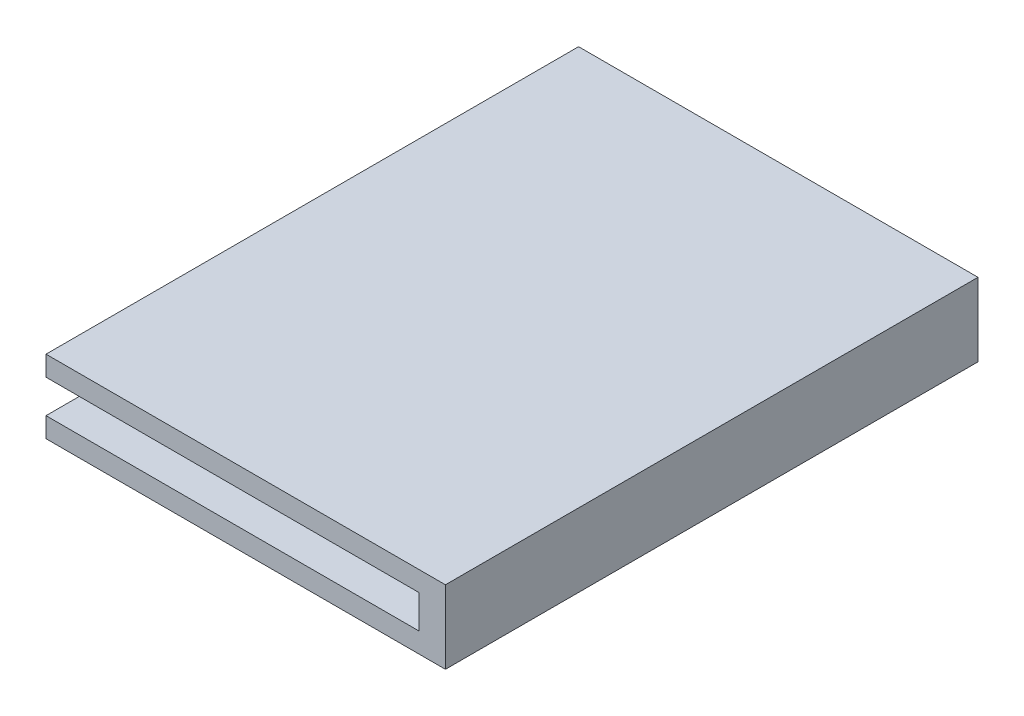
ISO-10303-21;
HEADER;
FILE_DESCRIPTION(('STEP AP214'),'2;1');
FILE_NAME('part.step','',(''),(''),'','','');
FILE_SCHEMA(('AUTOMOTIVE_DESIGN { 1 0 10303 214 1 1 1 1 }'));
ENDSEC;
DATA;
#1=APPLICATION_CONTEXT('core data for automotive mechanical design processes');
#2=APPLICATION_PROTOCOL_DEFINITION('international standard','automotive_design',2000,#1);
#3=PRODUCT_CONTEXT('',#1,'mechanical');
#4=PRODUCT('Part','Part','',(#3));
#5=PRODUCT_RELATED_PRODUCT_CATEGORY('part','',(#4));
#6=PRODUCT_DEFINITION_FORMATION('','',#4);
#7=PRODUCT_DEFINITION_CONTEXT('part definition',#1,'design');
#8=PRODUCT_DEFINITION('design','',#6,#7);
#9=PRODUCT_DEFINITION_SHAPE('','',#8);
#10=(LENGTH_UNIT() NAMED_UNIT(*) SI_UNIT(.MILLI.,.METRE.));
#11=(NAMED_UNIT(*) PLANE_ANGLE_UNIT() SI_UNIT($,.RADIAN.));
#12=(NAMED_UNIT(*) SI_UNIT($,.STERADIAN.) SOLID_ANGLE_UNIT());
#13=UNCERTAINTY_MEASURE_WITH_UNIT(LENGTH_MEASURE(1.E-05),#10,'distance_accuracy_value','');
#14=(GEOMETRIC_REPRESENTATION_CONTEXT(3) GLOBAL_UNCERTAINTY_ASSIGNED_CONTEXT((#13)) GLOBAL_UNIT_ASSIGNED_CONTEXT((#10,
#11,#12)) REPRESENTATION_CONTEXT('',''));
#15=CARTESIAN_POINT('',(0.,0.,0.));
#16=DIRECTION('',(0.,0.,1.));
#17=DIRECTION('',(1.,0.,0.));
#18=AXIS2_PLACEMENT_3D('',#15,#16,#17);
#19=CARTESIAN_POINT('',(-56.,0.,80.));
#20=DIRECTION('',(0.,1.,0.));
#21=DIRECTION('',(0.,0.,1.));
#22=AXIS2_PLACEMENT_3D('',#19,#20,#21);
#23=PLANE('',#22);
#24=DIRECTION('',(1.,0.,0.));
#25=VECTOR('',#24,1.);
#26=CARTESIAN_POINT('',(-56.,0.,0.));
#27=LINE('',#26,#25);
#28=CARTESIAN_POINT('',(-56.,0.,0.));
#29=VERTEX_POINT('',#28);
#30=CARTESIAN_POINT('',(0.,0.,0.));
#31=VERTEX_POINT('',#30);
#32=EDGE_CURVE('E140',#29,#31,#27,.T.);
#33=ORIENTED_EDGE('',*,*,#32,.T.);
#34=DIRECTION('',(0.,0.,-1.));
#35=VECTOR('',#34,1.);
#36=CARTESIAN_POINT('',(0.,0.,80.));
#37=LINE('',#36,#35);
#38=CARTESIAN_POINT('',(0.,0.,80.));
#39=VERTEX_POINT('',#38);
#40=EDGE_CURVE('E11',#39,#31,#37,.T.);
#41=ORIENTED_EDGE('',*,*,#40,.F.);
#42=DIRECTION('',(1.,0.,0.));
#43=VECTOR('',#42,1.);
#44=CARTESIAN_POINT('',(-56.,0.,80.));
#45=LINE('',#44,#43);
#46=CARTESIAN_POINT('',(-56.,0.,80.));
#47=VERTEX_POINT('',#46);
#48=EDGE_CURVE('E162',#47,#39,#45,.T.);
#49=ORIENTED_EDGE('',*,*,#48,.F.);
#50=DIRECTION('',(0.,0.,-1.));
#51=VECTOR('',#50,1.);
#52=CARTESIAN_POINT('',(-56.,0.,80.));
#53=LINE('',#52,#51);
#54=EDGE_CURVE('E136',#47,#29,#53,.T.);
#55=ORIENTED_EDGE('',*,*,#54,.T.);
#56=EDGE_LOOP('',(#33,#41,#49,#55));
#57=FACE_BOUND('',#56,.T.);
#58=ADVANCED_FACE('F39',(#57),#23,.F.);
#59=CARTESIAN_POINT('',(0.,0.,80.));
#60=DIRECTION('',(1.,0.,0.));
#61=DIRECTION('',(0.,0.,-1.));
#62=AXIS2_PLACEMENT_3D('',#59,#60,#61);
#63=PLANE('',#62);
#64=DIRECTION('',(0.,-1.,0.));
#65=VECTOR('',#64,1.);
#66=CARTESIAN_POINT('',(0.,0.,0.));
#67=LINE('',#66,#65);
#68=CARTESIAN_POINT('',(0.,-5.,0.));
#69=VERTEX_POINT('',#68);
#70=EDGE_CURVE('E144',#31,#69,#67,.T.);
#71=ORIENTED_EDGE('',*,*,#70,.T.);
#72=DIRECTION('',(0.,0.,-1.));
#73=VECTOR('',#72,1.);
#74=CARTESIAN_POINT('',(0.,-5.,80.));
#75=LINE('',#74,#73);
#76=CARTESIAN_POINT('',(0.,-5.,80.));
#77=VERTEX_POINT('',#76);
#78=EDGE_CURVE('E48',#77,#69,#75,.T.);
#79=ORIENTED_EDGE('',*,*,#78,.F.);
#80=DIRECTION('',(0.,-1.,0.));
#81=VECTOR('',#80,1.);
#82=CARTESIAN_POINT('',(0.,0.,80.));
#83=LINE('',#82,#81);
#84=EDGE_CURVE('E99',#39,#77,#83,.T.);
#85=ORIENTED_EDGE('',*,*,#84,.F.);
#86=ORIENTED_EDGE('',*,*,#40,.T.);
#87=EDGE_LOOP('',(#71,#79,#85,#86));
#88=FACE_BOUND('',#87,.T.);
#89=ADVANCED_FACE('F208',(#88),#63,.F.);
#90=CARTESIAN_POINT('',(0.,-5.,80.));
#91=DIRECTION('',(0.,-1.,0.));
#92=DIRECTION('',(1.,0.,0.));
#93=AXIS2_PLACEMENT_3D('',#90,#91,#92);
#94=PLANE('',#93);
#95=DIRECTION('',(-1.,0.,0.));
#96=VECTOR('',#95,1.);
#97=CARTESIAN_POINT('',(0.,-5.,0.));
#98=LINE('',#97,#96);
#99=CARTESIAN_POINT('',(-56.,-5.00000000000001,0.));
#100=VERTEX_POINT('',#99);
#101=EDGE_CURVE('E147',#69,#100,#98,.T.);
#102=ORIENTED_EDGE('',*,*,#101,.T.);
#103=DIRECTION('',(0.,0.,-1.));
#104=VECTOR('',#103,1.);
#105=CARTESIAN_POINT('',(-56.,-5.00000000000001,80.));
#106=LINE('',#105,#104);
#107=CARTESIAN_POINT('',(-56.,-5.00000000000001,80.));
#108=VERTEX_POINT('',#107);
#109=EDGE_CURVE('E173',#108,#100,#106,.T.);
#110=ORIENTED_EDGE('',*,*,#109,.F.);
#111=DIRECTION('',(-1.,0.,0.));
#112=VECTOR('',#111,1.);
#113=CARTESIAN_POINT('',(0.,-5.,80.));
#114=LINE('',#113,#112);
#115=EDGE_CURVE('E183',#77,#108,#114,.T.);
#116=ORIENTED_EDGE('',*,*,#115,.F.);
#117=ORIENTED_EDGE('',*,*,#78,.T.);
#118=EDGE_LOOP('',(#102,#110,#116,#117));
#119=FACE_BOUND('',#118,.T.);
#120=ADVANCED_FACE('F181',(#119),#94,.F.);
#121=CARTESIAN_POINT('',(-56.,-5.00000000000001,80.));
#122=DIRECTION('',(1.,0.,0.));
#123=DIRECTION('',(0.,0.,-1.));
#124=AXIS2_PLACEMENT_3D('',#121,#122,#123);
#125=PLANE('',#124);
#126=DIRECTION('',(0.,-1.,0.));
#127=VECTOR('',#126,1.);
#128=CARTESIAN_POINT('',(-56.,-5.00000000000001,0.));
#129=LINE('',#128,#127);
#130=CARTESIAN_POINT('',(-56.,-8.00000000000001,0.));
#131=VERTEX_POINT('',#130);
#132=EDGE_CURVE('E150',#100,#131,#129,.T.);
#133=ORIENTED_EDGE('',*,*,#132,.T.);
#134=DIRECTION('',(0.,0.,-1.));
#135=VECTOR('',#134,1.);
#136=CARTESIAN_POINT('',(-56.,-8.00000000000001,80.));
#137=LINE('',#136,#135);
#138=CARTESIAN_POINT('',(-56.,-8.00000000000001,80.));
#139=VERTEX_POINT('',#138);
#140=EDGE_CURVE('E169',#139,#131,#137,.T.);
#141=ORIENTED_EDGE('',*,*,#140,.F.);
#142=DIRECTION('',(0.,-1.,0.));
#143=VECTOR('',#142,1.);
#144=CARTESIAN_POINT('',(-56.,-5.00000000000001,80.));
#145=LINE('',#144,#143);
#146=EDGE_CURVE('E196',#108,#139,#145,.T.);
#147=ORIENTED_EDGE('',*,*,#146,.F.);
#148=ORIENTED_EDGE('',*,*,#109,.T.);
#149=EDGE_LOOP('',(#133,#141,#147,#148));
#150=FACE_BOUND('',#149,.T.);
#151=ADVANCED_FACE('F191',(#150),#125,.F.);
#152=CARTESIAN_POINT('',(-56.,-8.00000000000001,80.));
#153=DIRECTION('',(0.,1.,0.));
#154=DIRECTION('',(0.,0.,1.));
#155=AXIS2_PLACEMENT_3D('',#152,#153,#154);
#156=PLANE('',#155);
#157=DIRECTION('',(1.,0.,0.));
#158=VECTOR('',#157,1.);
#159=CARTESIAN_POINT('',(-56.,-8.00000000000001,0.));
#160=LINE('',#159,#158);
#161=CARTESIAN_POINT('',(4.,-8.00000000000001,0.));
#162=VERTEX_POINT('',#161);
#163=EDGE_CURVE('E153',#131,#162,#160,.T.);
#164=ORIENTED_EDGE('',*,*,#163,.T.);
#165=DIRECTION('',(0.,0.,-1.));
#166=VECTOR('',#165,1.);
#167=CARTESIAN_POINT('',(4.,-8.00000000000001,80.));
#168=LINE('',#167,#166);
#169=CARTESIAN_POINT('',(4.,-8.00000000000001,80.));
#170=VERTEX_POINT('',#169);
#171=EDGE_CURVE('E129',#170,#162,#168,.T.);
#172=ORIENTED_EDGE('',*,*,#171,.F.);
#173=DIRECTION('',(1.,0.,0.));
#174=VECTOR('',#173,1.);
#175=CARTESIAN_POINT('',(-56.,-8.00000000000001,80.));
#176=LINE('',#175,#174);
#177=EDGE_CURVE('E118',#139,#170,#176,.T.);
#178=ORIENTED_EDGE('',*,*,#177,.F.);
#179=ORIENTED_EDGE('',*,*,#140,.T.);
#180=EDGE_LOOP('',(#164,#172,#178,#179));
#181=FACE_BOUND('',#180,.T.);
#182=ADVANCED_FACE('F194',(#181),#156,.F.);
#183=CARTESIAN_POINT('',(4.,-8.00000000000001,80.));
#184=DIRECTION('',(-1.,0.,0.));
#185=DIRECTION('',(0.,0.,1.));
#186=AXIS2_PLACEMENT_3D('',#183,#184,#185);
#187=PLANE('',#186);
#188=DIRECTION('',(0.,1.,0.));
#189=VECTOR('',#188,1.);
#190=CARTESIAN_POINT('',(4.,-8.00000000000001,0.));
#191=LINE('',#190,#189);
#192=CARTESIAN_POINT('',(4.,3.,0.));
#193=VERTEX_POINT('',#192);
#194=EDGE_CURVE('E127',#162,#193,#191,.T.);
#195=ORIENTED_EDGE('',*,*,#194,.T.);
#196=DIRECTION('',(0.,0.,-1.));
#197=VECTOR('',#196,1.);
#198=CARTESIAN_POINT('',(4.,3.,80.));
#199=LINE('',#198,#197);
#200=CARTESIAN_POINT('',(4.,3.,80.));
#201=VERTEX_POINT('',#200);
#202=EDGE_CURVE('E124',#201,#193,#199,.T.);
#203=ORIENTED_EDGE('',*,*,#202,.F.);
#204=DIRECTION('',(0.,1.,0.));
#205=VECTOR('',#204,1.);
#206=CARTESIAN_POINT('',(4.,-8.00000000000001,80.));
#207=LINE('',#206,#205);
#208=EDGE_CURVE('E112',#170,#201,#207,.T.);
#209=ORIENTED_EDGE('',*,*,#208,.F.);
#210=ORIENTED_EDGE('',*,*,#171,.T.);
#211=EDGE_LOOP('',(#195,#203,#209,#210));
#212=FACE_BOUND('',#211,.T.);
#213=ADVANCED_FACE('F125',(#212),#187,.F.);
#214=CARTESIAN_POINT('',(4.,3.,80.));
#215=DIRECTION('',(0.,-1.,0.));
#216=DIRECTION('',(1.,0.,0.));
#217=AXIS2_PLACEMENT_3D('',#214,#215,#216);
#218=PLANE('',#217);
#219=DIRECTION('',(-1.,0.,0.));
#220=VECTOR('',#219,1.);
#221=CARTESIAN_POINT('',(4.,3.,0.));
#222=LINE('',#221,#220);
#223=CARTESIAN_POINT('',(-56.,3.,0.));
#224=VERTEX_POINT('',#223);
#225=EDGE_CURVE('E85',#193,#224,#222,.T.);
#226=ORIENTED_EDGE('',*,*,#225,.T.);
#227=DIRECTION('',(0.,0.,-1.));
#228=VECTOR('',#227,1.);
#229=CARTESIAN_POINT('',(-56.,3.,80.));
#230=LINE('',#229,#228);
#231=CARTESIAN_POINT('',(-56.,3.,80.));
#232=VERTEX_POINT('',#231);
#233=EDGE_CURVE('E130',#232,#224,#230,.T.);
#234=ORIENTED_EDGE('',*,*,#233,.F.);
#235=DIRECTION('',(-1.,0.,0.));
#236=VECTOR('',#235,1.);
#237=CARTESIAN_POINT('',(4.,3.,80.));
#238=LINE('',#237,#236);
#239=EDGE_CURVE('E116',#201,#232,#238,.T.);
#240=ORIENTED_EDGE('',*,*,#239,.F.);
#241=ORIENTED_EDGE('',*,*,#202,.T.);
#242=EDGE_LOOP('',(#226,#234,#240,#241));
#243=FACE_BOUND('',#242,.T.);
#244=ADVANCED_FACE('F132',(#243),#218,.F.);
#245=CARTESIAN_POINT('',(-56.,3.,80.));
#246=DIRECTION('',(1.,0.,0.));
#247=DIRECTION('',(0.,0.,-1.));
#248=AXIS2_PLACEMENT_3D('',#245,#246,#247);
#249=PLANE('',#248);
#250=DIRECTION('',(0.,-1.,0.));
#251=VECTOR('',#250,1.);
#252=CARTESIAN_POINT('',(-56.,3.,0.));
#253=LINE('',#252,#251);
#254=EDGE_CURVE('E91',#224,#29,#253,.T.);
#255=ORIENTED_EDGE('',*,*,#254,.T.);
#256=ORIENTED_EDGE('',*,*,#54,.F.);
#257=DIRECTION('',(0.,-1.,0.));
#258=VECTOR('',#257,1.);
#259=CARTESIAN_POINT('',(-56.,3.,80.));
#260=LINE('',#259,#258);
#261=EDGE_CURVE('E56',#232,#47,#260,.T.);
#262=ORIENTED_EDGE('',*,*,#261,.F.);
#263=ORIENTED_EDGE('',*,*,#233,.T.);
#264=EDGE_LOOP('',(#255,#256,#262,#263));
#265=FACE_BOUND('',#264,.T.);
#266=ADVANCED_FACE('F224',(#265),#249,.F.);
#267=CARTESIAN_POINT('',(0.,0.,80.));
#268=DIRECTION('',(0.,0.,-1.));
#269=DIRECTION('',(-1.,0.,0.));
#270=AXIS2_PLACEMENT_3D('',#267,#268,#269);
#271=PLANE('',#270);
#272=ORIENTED_EDGE('',*,*,#48,.T.);
#273=ORIENTED_EDGE('',*,*,#84,.T.);
#274=ORIENTED_EDGE('',*,*,#115,.T.);
#275=ORIENTED_EDGE('',*,*,#146,.T.);
#276=ORIENTED_EDGE('',*,*,#177,.T.);
#277=ORIENTED_EDGE('',*,*,#208,.T.);
#278=ORIENTED_EDGE('',*,*,#239,.T.);
#279=ORIENTED_EDGE('',*,*,#261,.T.);
#280=EDGE_LOOP('',(#272,#273,#274,#275,#276,#277,#278,#279));
#281=FACE_BOUND('',#280,.T.);
#282=ADVANCED_FACE('F114',(#281),#271,.F.);
#283=CARTESIAN_POINT('',(0.,0.,0.));
#284=DIRECTION('',(0.,0.,-1.));
#285=DIRECTION('',(-1.,0.,0.));
#286=AXIS2_PLACEMENT_3D('',#283,#284,#285);
#287=PLANE('',#286);
#288=ORIENTED_EDGE('',*,*,#32,.F.);
#289=ORIENTED_EDGE('',*,*,#254,.F.);
#290=ORIENTED_EDGE('',*,*,#225,.F.);
#291=ORIENTED_EDGE('',*,*,#194,.F.);
#292=ORIENTED_EDGE('',*,*,#163,.F.);
#293=ORIENTED_EDGE('',*,*,#132,.F.);
#294=ORIENTED_EDGE('',*,*,#101,.F.);
#295=ORIENTED_EDGE('',*,*,#70,.F.);
#296=EDGE_LOOP('',(#288,#289,#290,#291,#292,#293,#294,#295));
#297=FACE_BOUND('',#296,.T.);
#298=ADVANCED_FACE('F187',(#297),#287,.T.);
#299=CLOSED_SHELL('',(#58,#89,#120,#151,#182,#213,#244,#266,#282,#298));
#300=MANIFOLD_SOLID_BREP('B2',#299);
#301=ADVANCED_BREP_SHAPE_REPRESENTATION('',(#18,#300),#14);
#302=SHAPE_DEFINITION_REPRESENTATION(#9,#301);
ENDSEC;
END-ISO-10303-21;
